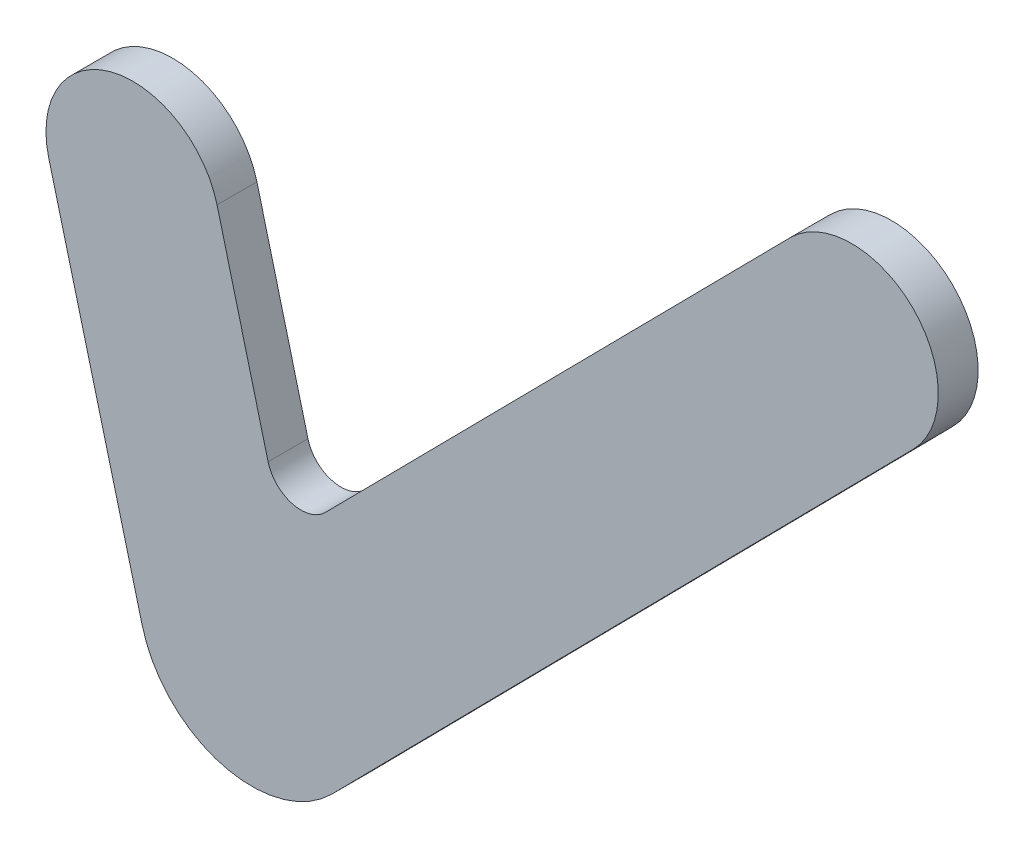
ISO-10303-21;
HEADER;
FILE_DESCRIPTION(('STEP AP214'),'2;1');
FILE_NAME('part.step','',(''),(''),'','','');
FILE_SCHEMA(('AUTOMOTIVE_DESIGN { 1 0 10303 214 1 1 1 1 }'));
ENDSEC;
DATA;
#1=APPLICATION_CONTEXT('core data for automotive mechanical design processes');
#2=APPLICATION_PROTOCOL_DEFINITION('international standard','automotive_design',2000,#1);
#3=PRODUCT_CONTEXT('',#1,'mechanical');
#4=PRODUCT('Part','Part','',(#3));
#5=PRODUCT_RELATED_PRODUCT_CATEGORY('part','',(#4));
#6=PRODUCT_DEFINITION_FORMATION('','',#4);
#7=PRODUCT_DEFINITION_CONTEXT('part definition',#1,'design');
#8=PRODUCT_DEFINITION('design','',#6,#7);
#9=PRODUCT_DEFINITION_SHAPE('','',#8);
#10=(LENGTH_UNIT() NAMED_UNIT(*) SI_UNIT(.MILLI.,.METRE.));
#11=(NAMED_UNIT(*) PLANE_ANGLE_UNIT() SI_UNIT($,.RADIAN.));
#12=(NAMED_UNIT(*) SI_UNIT($,.STERADIAN.) SOLID_ANGLE_UNIT());
#13=UNCERTAINTY_MEASURE_WITH_UNIT(LENGTH_MEASURE(1.E-05),#10,'distance_accuracy_value','');
#14=(GEOMETRIC_REPRESENTATION_CONTEXT(3) GLOBAL_UNCERTAINTY_ASSIGNED_CONTEXT((#13)) GLOBAL_UNIT_ASSIGNED_CONTEXT((#10,
#11,#12)) REPRESENTATION_CONTEXT('',''));
#15=CARTESIAN_POINT('',(0.,0.,0.));
#16=DIRECTION('',(0.,0.,1.));
#17=DIRECTION('',(1.,0.,0.));
#18=AXIS2_PLACEMENT_3D('',#15,#16,#17);
#19=CARTESIAN_POINT('',(0.,0.,0.05));
#20=DIRECTION('',(0.,0.,1.));
#21=DIRECTION('',(1.,0.,0.));
#22=AXIS2_PLACEMENT_3D('',#19,#20,#21);
#23=PLANE('',#22);
#24=DIRECTION('',(0.702273683817487,0.711907067683287,0.));
#25=VECTOR('',#24,1.);
#26=CARTESIAN_POINT('',(-0.002,-0.371,0.05));
#27=LINE('',#26,#25);
#28=CARTESIAN_POINT('',(0.727000000000016,0.367999999999984,0.05));
#29=VERTEX_POINT('',#28);
#30=CARTESIAN_POINT('',(-0.002,-0.371,0.05));
#31=VERTEX_POINT('',#30);
#32=EDGE_CURVE('E92',#29,#31,#27,.F.);
#33=ORIENTED_EDGE('',*,*,#32,.F.);
#34=CARTESIAN_POINT('',(0.65,0.4445,0.05));
#35=DIRECTION('',(0.,0.,1.));
#36=DIRECTION('',(1.,0.,0.));
#37=AXIS2_PLACEMENT_3D('',#34,#35,#36);
#38=CIRCLE('',#37,0.1085414667305);
#39=CARTESIAN_POINT('',(0.573,0.521,0.05));
#40=VERTEX_POINT('',#39);
#41=EDGE_CURVE('E20',#40,#29,#38,.F.);
#42=ORIENTED_EDGE('',*,*,#41,.F.);
#43=DIRECTION('',(-0.702874532245624,-0.711313849099324,0.));
#44=VECTOR('',#43,1.);
#45=CARTESIAN_POINT('',(0.573,0.521,0.05));
#46=LINE('',#45,#44);
#47=CARTESIAN_POINT('',(-0.0100000000000026,-0.0689999999999976,0.05));
#48=VERTEX_POINT('',#47);
#49=EDGE_CURVE('E77',#48,#40,#46,.F.);
#50=ORIENTED_EDGE('',*,*,#49,.F.);
#51=CARTESIAN_POINT('',(-0.04060719196449,-0.03906409586545,0.05));
#52=DIRECTION('',(0.,0.,1.));
#53=DIRECTION('',(1.,0.,0.));
#54=AXIS2_PLACEMENT_3D('',#51,#52,#53);
#55=CIRCLE('',#54,0.04281306525238);
#56=CARTESIAN_POINT('',(-0.082,-0.05,0.05));
#57=VERTEX_POINT('',#56);
#58=EDGE_CURVE('E100',#48,#57,#55,.F.);
#59=ORIENTED_EDGE('',*,*,#58,.T.);
#60=DIRECTION('',(-0.250826144378794,0.968032150961975,0.));
#61=VECTOR('',#60,1.);
#62=CARTESIAN_POINT('',(-0.082,-0.05,0.05));
#63=LINE('',#62,#61);
#64=CARTESIAN_POINT('',(-0.145999999999966,0.197000000000009,0.05));
#65=VERTEX_POINT('',#64);
#66=EDGE_CURVE('E110',#65,#57,#63,.F.);
#67=ORIENTED_EDGE('',*,*,#66,.F.);
#68=CARTESIAN_POINT('',(-0.2515,0.1695,0.05));
#69=DIRECTION('',(0.,0.,1.));
#70=DIRECTION('',(1.,0.,0.));
#71=AXIS2_PLACEMENT_3D('',#68,#69,#70);
#72=CIRCLE('',#71,0.1090252264387);
#73=CARTESIAN_POINT('',(-0.357,0.142,0.05));
#74=VERTEX_POINT('',#73);
#75=EDGE_CURVE('E128',#74,#65,#72,.F.);
#76=ORIENTED_EDGE('',*,*,#75,.F.);
#77=DIRECTION('',(0.252685639514992,-0.967548431647171,0.));
#78=VECTOR('',#77,1.);
#79=CARTESIAN_POINT('',(-0.357,0.142,0.05));
#80=LINE('',#79,#78);
#81=CARTESIAN_POINT('',(-0.240000000000021,-0.306000000000005,0.05));
#82=VERTEX_POINT('',#81);
#83=EDGE_CURVE('E106',#82,#74,#80,.F.);
#84=ORIENTED_EDGE('',*,*,#83,.F.);
#85=CARTESIAN_POINT('',(-0.1025509198785,-0.2709479835553,0.05));
#86=DIRECTION('',(0.,0.,1.));
#87=DIRECTION('',(1.,0.,0.));
#88=AXIS2_PLACEMENT_3D('',#85,#86,#87);
#89=CIRCLE('',#88,0.1418481352824);
#90=EDGE_CURVE('E125',#31,#82,#89,.F.);
#91=ORIENTED_EDGE('',*,*,#90,.F.);
#92=EDGE_LOOP('',(#33,#42,#50,#59,#67,#76,#84,#91));
#93=FACE_BOUND('',#92,.T.);
#94=ADVANCED_FACE('F17',(#93),#23,.T.);
#95=CARTESIAN_POINT('',(0.65,0.4445,0.));
#96=DIRECTION('',(0.,0.,1.));
#97=DIRECTION('',(1.,0.,0.));
#98=AXIS2_PLACEMENT_3D('',#95,#96,#97);
#99=CYLINDRICAL_SURFACE('',#98,0.1085414667305);
#100=DIRECTION('',(0.,0.,1.));
#101=VECTOR('',#100,1.);
#102=CARTESIAN_POINT('',(0.727000000000005,0.367999999999996,0.));
#103=LINE('',#102,#101);
#104=CARTESIAN_POINT('',(0.727000000000015,0.367999999999986,0.));
#105=VERTEX_POINT('',#104);
#106=EDGE_CURVE('E105',#105,#29,#103,.T.);
#107=ORIENTED_EDGE('',*,*,#106,.F.);
#108=CARTESIAN_POINT('',(0.65,0.4445,0.));
#109=DIRECTION('',(0.,0.,1.));
#110=DIRECTION('',(1.,0.,0.));
#111=AXIS2_PLACEMENT_3D('',#108,#109,#110);
#112=CIRCLE('',#111,0.1085414667305);
#113=CARTESIAN_POINT('',(0.573,0.521,0.));
#114=VERTEX_POINT('',#113);
#115=EDGE_CURVE('E98',#105,#114,#112,.T.);
#116=ORIENTED_EDGE('',*,*,#115,.T.);
#117=DIRECTION('',(0.,0.,1.));
#118=VECTOR('',#117,1.);
#119=CARTESIAN_POINT('',(0.573,0.521,0.));
#120=LINE('',#119,#118);
#121=EDGE_CURVE('E82',#40,#114,#120,.F.);
#122=ORIENTED_EDGE('',*,*,#121,.F.);
#123=ORIENTED_EDGE('',*,*,#41,.T.);
#124=EDGE_LOOP('',(#107,#116,#122,#123));
#125=FACE_BOUND('',#124,.T.);
#126=ADVANCED_FACE('F97',(#125),#99,.T.);
#127=CARTESIAN_POINT('',(0.573,0.521,0.));
#128=DIRECTION('',(-0.711313849099324,0.702874532245624,0.));
#129=DIRECTION('',(-0.702874532245624,-0.711313849099324,0.));
#130=AXIS2_PLACEMENT_3D('',#127,#128,#129);
#131=PLANE('',#130);
#132=ORIENTED_EDGE('',*,*,#121,.T.);
#133=DIRECTION('',(-0.702874532245613,-0.711313849099334,0.));
#134=VECTOR('',#133,1.);
#135=CARTESIAN_POINT('',(0.573,0.521,0.));
#136=LINE('',#135,#134);
#137=CARTESIAN_POINT('',(-0.00999999999999728,-0.0690000000000027,0.));
#138=VERTEX_POINT('',#137);
#139=EDGE_CURVE('E123',#114,#138,#136,.T.);
#140=ORIENTED_EDGE('',*,*,#139,.T.);
#141=DIRECTION('',(0.,0.,1.));
#142=VECTOR('',#141,1.);
#143=CARTESIAN_POINT('',(-0.00999999999999636,-0.0690000000000036,0.));
#144=LINE('',#143,#142);
#145=EDGE_CURVE('E84',#138,#48,#144,.T.);
#146=ORIENTED_EDGE('',*,*,#145,.T.);
#147=ORIENTED_EDGE('',*,*,#49,.T.);
#148=EDGE_LOOP('',(#132,#140,#146,#147));
#149=FACE_BOUND('',#148,.T.);
#150=ADVANCED_FACE('F79',(#149),#131,.T.);
#151=CARTESIAN_POINT('',(-0.04060719196449,-0.03906409586545,0.));
#152=DIRECTION('',(0.,0.,1.));
#153=DIRECTION('',(1.,0.,0.));
#154=AXIS2_PLACEMENT_3D('',#151,#152,#153);
#155=CYLINDRICAL_SURFACE('',#154,0.04281306525238);
#156=ORIENTED_EDGE('',*,*,#58,.F.);
#157=ORIENTED_EDGE('',*,*,#145,.F.);
#158=CARTESIAN_POINT('',(-0.04060719196449,-0.03906409586545,0.));
#159=DIRECTION('',(0.,0.,1.));
#160=DIRECTION('',(1.,0.,0.));
#161=AXIS2_PLACEMENT_3D('',#158,#159,#160);
#162=CIRCLE('',#161,0.04281306525238);
#163=CARTESIAN_POINT('',(-0.082,-0.05,0.));
#164=VERTEX_POINT('',#163);
#165=EDGE_CURVE('E120',#138,#164,#162,.F.);
#166=ORIENTED_EDGE('',*,*,#165,.T.);
#167=DIRECTION('',(0.,0.,1.));
#168=VECTOR('',#167,1.);
#169=CARTESIAN_POINT('',(-0.082,-0.05,0.));
#170=LINE('',#169,#168);
#171=EDGE_CURVE('E111',#57,#164,#170,.F.);
#172=ORIENTED_EDGE('',*,*,#171,.F.);
#173=EDGE_LOOP('',(#156,#157,#166,#172));
#174=FACE_BOUND('',#173,.T.);
#175=ADVANCED_FACE('F134',(#174),#155,.F.);
#176=CARTESIAN_POINT('',(-0.082,-0.05,0.));
#177=DIRECTION('',(0.968032150961975,0.250826144378794,0.));
#178=DIRECTION('',(-0.250826144378794,0.968032150961975,0.));
#179=AXIS2_PLACEMENT_3D('',#176,#177,#178);
#180=PLANE('',#179);
#181=ORIENTED_EDGE('',*,*,#171,.T.);
#182=DIRECTION('',(-0.25082614437881,0.968032150961971,0.));
#183=VECTOR('',#182,1.);
#184=CARTESIAN_POINT('',(-0.082,-0.05,0.));
#185=LINE('',#184,#183);
#186=CARTESIAN_POINT('',(-0.145999999999967,0.197000000000009,0.));
#187=VERTEX_POINT('',#186);
#188=EDGE_CURVE('E119',#164,#187,#185,.T.);
#189=ORIENTED_EDGE('',*,*,#188,.T.);
#190=DIRECTION('',(0.,0.,1.));
#191=VECTOR('',#190,1.);
#192=CARTESIAN_POINT('',(-0.145999999999956,0.197000000000011,0.));
#193=LINE('',#192,#191);
#194=EDGE_CURVE('E109',#65,#187,#193,.F.);
#195=ORIENTED_EDGE('',*,*,#194,.F.);
#196=ORIENTED_EDGE('',*,*,#66,.T.);
#197=EDGE_LOOP('',(#181,#189,#195,#196));
#198=FACE_BOUND('',#197,.T.);
#199=ADVANCED_FACE('F159',(#198),#180,.T.);
#200=CARTESIAN_POINT('',(-0.2515,0.1695,0.));
#201=DIRECTION('',(0.,0.,1.));
#202=DIRECTION('',(1.,0.,0.));
#203=AXIS2_PLACEMENT_3D('',#200,#201,#202);
#204=CYLINDRICAL_SURFACE('',#203,0.1090252264387);
#205=ORIENTED_EDGE('',*,*,#194,.T.);
#206=CARTESIAN_POINT('',(-0.2515,0.1695,0.));
#207=DIRECTION('',(0.,0.,1.));
#208=DIRECTION('',(1.,0.,0.));
#209=AXIS2_PLACEMENT_3D('',#206,#207,#208);
#210=CIRCLE('',#209,0.1090252264387);
#211=CARTESIAN_POINT('',(-0.357,0.142,0.));
#212=VERTEX_POINT('',#211);
#213=EDGE_CURVE('E116',#187,#212,#210,.T.);
#214=ORIENTED_EDGE('',*,*,#213,.T.);
#215=DIRECTION('',(0.,0.,1.));
#216=VECTOR('',#215,1.);
#217=CARTESIAN_POINT('',(-0.357,0.142,0.));
#218=LINE('',#217,#216);
#219=EDGE_CURVE('E108',#74,#212,#218,.F.);
#220=ORIENTED_EDGE('',*,*,#219,.F.);
#221=ORIENTED_EDGE('',*,*,#75,.T.);
#222=EDGE_LOOP('',(#205,#214,#220,#221));
#223=FACE_BOUND('',#222,.T.);
#224=ADVANCED_FACE('F158',(#223),#204,.T.);
#225=CARTESIAN_POINT('',(-0.357,0.142,0.));
#226=DIRECTION('',(-0.967548431647171,-0.252685639514992,0.));
#227=DIRECTION('',(0.252685639514992,-0.967548431647171,0.));
#228=AXIS2_PLACEMENT_3D('',#225,#226,#227);
#229=PLANE('',#228);
#230=ORIENTED_EDGE('',*,*,#219,.T.);
#231=DIRECTION('',(0.252685639514997,-0.967548431647169,0.));
#232=VECTOR('',#231,1.);
#233=CARTESIAN_POINT('',(-0.357,0.142,0.));
#234=LINE('',#233,#232);
#235=CARTESIAN_POINT('',(-0.240000000000021,-0.306000000000005,0.));
#236=VERTEX_POINT('',#235);
#237=EDGE_CURVE('E115',#212,#236,#234,.T.);
#238=ORIENTED_EDGE('',*,*,#237,.T.);
#239=DIRECTION('',(0.,0.,1.));
#240=VECTOR('',#239,1.);
#241=CARTESIAN_POINT('',(-0.240000000000027,-0.306000000000007,0.));
#242=LINE('',#241,#240);
#243=EDGE_CURVE('E127',#82,#236,#242,.F.);
#244=ORIENTED_EDGE('',*,*,#243,.F.);
#245=ORIENTED_EDGE('',*,*,#83,.T.);
#246=EDGE_LOOP('',(#230,#238,#244,#245));
#247=FACE_BOUND('',#246,.T.);
#248=ADVANCED_FACE('F151',(#247),#229,.T.);
#249=CARTESIAN_POINT('',(-0.1025509198785,-0.2709479835553,0.));
#250=DIRECTION('',(0.,0.,1.));
#251=DIRECTION('',(1.,0.,0.));
#252=AXIS2_PLACEMENT_3D('',#249,#250,#251);
#253=CYLINDRICAL_SURFACE('',#252,0.1418481352824);
#254=ORIENTED_EDGE('',*,*,#243,.T.);
#255=CARTESIAN_POINT('',(-0.1025509198785,-0.2709479835553,0.));
#256=DIRECTION('',(0.,0.,1.));
#257=DIRECTION('',(1.,0.,0.));
#258=AXIS2_PLACEMENT_3D('',#255,#256,#257);
#259=CIRCLE('',#258,0.1418481352824);
#260=CARTESIAN_POINT('',(-0.002,-0.371,0.));
#261=VERTEX_POINT('',#260);
#262=EDGE_CURVE('E26',#236,#261,#259,.T.);
#263=ORIENTED_EDGE('',*,*,#262,.T.);
#264=DIRECTION('',(0.,0.,1.));
#265=VECTOR('',#264,1.);
#266=CARTESIAN_POINT('',(-0.002,-0.371,0.));
#267=LINE('',#266,#265);
#268=EDGE_CURVE('E34',#31,#261,#267,.F.);
#269=ORIENTED_EDGE('',*,*,#268,.F.);
#270=ORIENTED_EDGE('',*,*,#90,.T.);
#271=EDGE_LOOP('',(#254,#263,#269,#270));
#272=FACE_BOUND('',#271,.T.);
#273=ADVANCED_FACE('F162',(#272),#253,.T.);
#274=CARTESIAN_POINT('',(-0.002,-0.371,0.));
#275=DIRECTION('',(0.711907067683287,-0.702273683817487,0.));
#276=DIRECTION('',(0.702273683817487,0.711907067683287,0.));
#277=AXIS2_PLACEMENT_3D('',#274,#275,#276);
#278=PLANE('',#277);
#279=ORIENTED_EDGE('',*,*,#268,.T.);
#280=DIRECTION('',(0.702273683817482,0.711907067683291,0.));
#281=VECTOR('',#280,1.);
#282=CARTESIAN_POINT('',(-0.002,-0.371,0.));
#283=LINE('',#282,#281);
#284=EDGE_CURVE('E11',#261,#105,#283,.T.);
#285=ORIENTED_EDGE('',*,*,#284,.T.);
#286=ORIENTED_EDGE('',*,*,#106,.T.);
#287=ORIENTED_EDGE('',*,*,#32,.T.);
#288=EDGE_LOOP('',(#279,#285,#286,#287));
#289=FACE_BOUND('',#288,.T.);
#290=ADVANCED_FACE('F160',(#289),#278,.T.);
#291=CARTESIAN_POINT('',(0.,0.,0.));
#292=DIRECTION('',(0.,0.,1.));
#293=DIRECTION('',(1.,0.,0.));
#294=AXIS2_PLACEMENT_3D('',#291,#292,#293);
#295=PLANE('',#294);
#296=ORIENTED_EDGE('',*,*,#262,.F.);
#297=ORIENTED_EDGE('',*,*,#237,.F.);
#298=ORIENTED_EDGE('',*,*,#213,.F.);
#299=ORIENTED_EDGE('',*,*,#188,.F.);
#300=ORIENTED_EDGE('',*,*,#165,.F.);
#301=ORIENTED_EDGE('',*,*,#139,.F.);
#302=ORIENTED_EDGE('',*,*,#115,.F.);
#303=ORIENTED_EDGE('',*,*,#284,.F.);
#304=EDGE_LOOP('',(#296,#297,#298,#299,#300,#301,#302,#303));
#305=FACE_BOUND('',#304,.T.);
#306=ADVANCED_FACE('F156',(#305),#295,.F.);
#307=CLOSED_SHELL('',(#94,#126,#150,#175,#199,#224,#248,#273,#290,#306));
#308=MANIFOLD_SOLID_BREP('B1',#307);
#309=ADVANCED_BREP_SHAPE_REPRESENTATION('',(#18,#308),#14);
#310=SHAPE_DEFINITION_REPRESENTATION(#9,#309);
ENDSEC;
END-ISO-10303-21;
